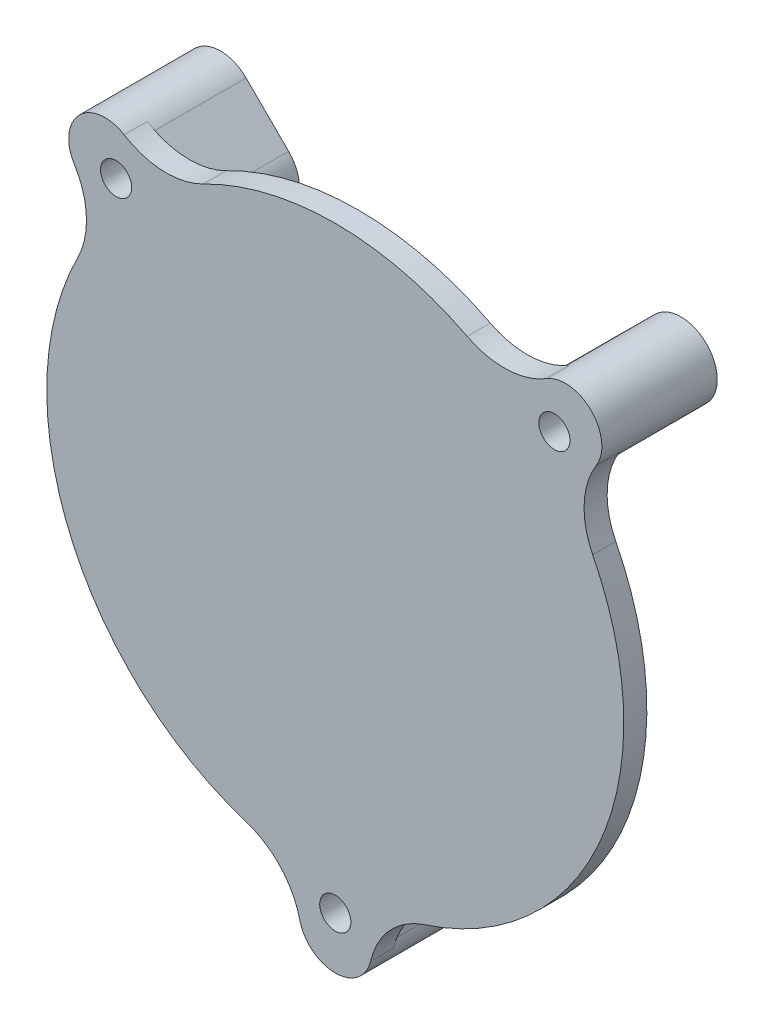
ISO-10303-21;
HEADER;
FILE_DESCRIPTION(('STEP AP214'),'2;1');
FILE_NAME('part.step','',(''),(''),'','','');
FILE_SCHEMA(('AUTOMOTIVE_DESIGN { 1 0 10303 214 1 1 1 1 }'));
ENDSEC;
DATA;
#1=APPLICATION_CONTEXT('core data for automotive mechanical design processes');
#2=APPLICATION_PROTOCOL_DEFINITION('international standard','automotive_design',2000,#1);
#3=PRODUCT_CONTEXT('',#1,'mechanical');
#4=PRODUCT('Part','Part','',(#3));
#5=PRODUCT_RELATED_PRODUCT_CATEGORY('part','',(#4));
#6=PRODUCT_DEFINITION_FORMATION('','',#4);
#7=PRODUCT_DEFINITION_CONTEXT('part definition',#1,'design');
#8=PRODUCT_DEFINITION('design','',#6,#7);
#9=PRODUCT_DEFINITION_SHAPE('','',#8);
#10=(LENGTH_UNIT() NAMED_UNIT(*) SI_UNIT(.MILLI.,.METRE.));
#11=(NAMED_UNIT(*) PLANE_ANGLE_UNIT() SI_UNIT($,.RADIAN.));
#12=(NAMED_UNIT(*) SI_UNIT($,.STERADIAN.) SOLID_ANGLE_UNIT());
#13=UNCERTAINTY_MEASURE_WITH_UNIT(LENGTH_MEASURE(1.E-05),#10,'distance_accuracy_value','');
#14=(GEOMETRIC_REPRESENTATION_CONTEXT(3) GLOBAL_UNCERTAINTY_ASSIGNED_CONTEXT((#13)) GLOBAL_UNIT_ASSIGNED_CONTEXT((#10,
#11,#12)) REPRESENTATION_CONTEXT('',''));
#15=CARTESIAN_POINT('',(0.,0.,0.));
#16=DIRECTION('',(0.,0.,1.));
#17=DIRECTION('',(1.,0.,0.));
#18=AXIS2_PLACEMENT_3D('',#15,#16,#17);
#19=CARTESIAN_POINT('',(0.,26.7665680473373,8.));
#20=DIRECTION('',(0.,0.,1.));
#21=DIRECTION('',(1.,0.,0.));
#22=AXIS2_PLACEMENT_3D('',#19,#20,#21);
#23=CYLINDRICAL_SURFACE('',#22,25.);
#24=CARTESIAN_POINT('',(0.,26.7665680473373,8.));
#25=DIRECTION('',(0.,0.,1.));
#26=DIRECTION('',(1.,0.,0.));
#27=AXIS2_PLACEMENT_3D('',#24,#25,#26);
#28=CIRCLE('',#27,25.);
#29=CARTESIAN_POINT('',(11.4326641616032,48.9992959539167,8.));
#30=VERTEX_POINT('',#29);
#31=CARTESIAN_POINT('',(-11.4326641616035,48.9992959539165,8.));
#32=VERTEX_POINT('',#31);
#33=EDGE_CURVE('E275',#30,#32,#28,.T.);
#34=ORIENTED_EDGE('',*,*,#33,.T.);
#35=DIRECTION('',(0.,0.,1.));
#36=VECTOR('',#35,1.);
#37=CARTESIAN_POINT('',(-11.4326641616035,48.9992959539165,8.));
#38=LINE('',#37,#36);
#39=CARTESIAN_POINT('',(-11.4326641616035,48.9992959539165,10.));
#40=VERTEX_POINT('',#39);
#41=EDGE_CURVE('E340',#32,#40,#38,.T.);
#42=ORIENTED_EDGE('',*,*,#41,.T.);
#43=CARTESIAN_POINT('',(0.,26.7665680473373,10.));
#44=DIRECTION('',(0.,0.,1.));
#45=DIRECTION('',(1.,0.,0.));
#46=AXIS2_PLACEMENT_3D('',#43,#44,#45);
#47=CIRCLE('',#46,25.);
#48=CARTESIAN_POINT('',(11.4326641616032,48.9992959539167,10.));
#49=VERTEX_POINT('',#48);
#50=EDGE_CURVE('E280',#49,#40,#47,.T.);
#51=ORIENTED_EDGE('',*,*,#50,.F.);
#52=DIRECTION('',(0.,0.,1.));
#53=VECTOR('',#52,1.);
#54=CARTESIAN_POINT('',(11.4326641616032,48.9992959539167,8.));
#55=LINE('',#54,#53);
#56=EDGE_CURVE('E337',#49,#30,#55,.F.);
#57=ORIENTED_EDGE('',*,*,#56,.T.);
#58=EDGE_LOOP('',(#34,#42,#51,#57));
#59=FACE_BOUND('',#58,.T.);
#60=ADVANCED_FACE('F34',(#59),#23,.T.);
#61=CARTESIAN_POINT('',(-22.3120005150945,38.0437411423298,10.));
#62=VERTEX_POINT('',#61);
#63=CARTESIAN_POINT('',(-7.71984683659709,2.98834345382563,10.));
#64=VERTEX_POINT('',#63);
#65=EDGE_CURVE('E270',#62,#64,#47,.T.);
#66=ORIENTED_EDGE('',*,*,#65,.F.);
#67=DIRECTION('',(0.,0.,1.));
#68=VECTOR('',#67,1.);
#69=CARTESIAN_POINT('',(-22.3120005150945,38.0437411423298,8.));
#70=LINE('',#69,#68);
#71=CARTESIAN_POINT('',(-22.3120005150945,38.0437411423298,8.));
#72=VERTEX_POINT('',#71);
#73=EDGE_CURVE('E323',#62,#72,#70,.F.);
#74=ORIENTED_EDGE('',*,*,#73,.T.);
#75=CARTESIAN_POINT('',(-7.71984683659709,2.98834345382563,8.));
#76=VERTEX_POINT('',#75);
#77=EDGE_CURVE('E276',#72,#76,#28,.T.);
#78=ORIENTED_EDGE('',*,*,#77,.T.);
#79=DIRECTION('',(0.,0.,1.));
#80=VECTOR('',#79,1.);
#81=CARTESIAN_POINT('',(-7.71984683659709,2.98834345382563,8.));
#82=LINE('',#81,#80);
#83=EDGE_CURVE('E321',#76,#64,#82,.T.);
#84=ORIENTED_EDGE('',*,*,#83,.T.);
#85=EDGE_LOOP('',(#66,#74,#78,#84));
#86=FACE_BOUND('',#85,.T.);
#87=ADVANCED_FACE('F400',(#86),#23,.T.);
#88=CARTESIAN_POINT('',(0.,26.7665680473373,8.));
#89=DIRECTION('',(0.,0.,1.));
#90=DIRECTION('',(1.,0.,0.));
#91=AXIS2_PLACEMENT_3D('',#88,#89,#90);
#92=PLANE('',#91);
#93=DIRECTION('',(0.709570736536527,-0.704634209963588,0.));
#94=VECTOR('',#93,1.);
#95=CARTESIAN_POINT('',(2.2195977613853,29.0017158674273,8.));
#96=LINE('',#95,#94);
#97=CARTESIAN_POINT('',(-17.7310961368432,48.8136115803503,8.));
#98=VERTEX_POINT('',#97);
#99=CARTESIAN_POINT('',(-14.0413283068533,45.1495136885397,8.));
#100=VERTEX_POINT('',#99);
#101=EDGE_CURVE('E201',#98,#100,#96,.T.);
#102=ORIENTED_EDGE('',*,*,#101,.F.);
#103=CARTESIAN_POINT('',(-19.9506938982285,46.5784637602603,8.));
#104=DIRECTION('',(0.,0.,1.));
#105=DIRECTION('',(1.,0.,0.));
#106=AXIS2_PLACEMENT_3D('',#103,#104,#105);
#107=CIRCLE('',#106,3.15);
#108=CARTESIAN_POINT('',(-18.3006265209049,49.2617039005184,8.));
#109=VERTEX_POINT('',#108);
#110=EDGE_CURVE('E326',#109,#98,#107,.F.);
#111=ORIENTED_EDGE('',*,*,#110,.F.);
#112=CARTESIAN_POINT('',(-14.6338101268525,55.2244597677587,8.));
#113=DIRECTION('',(0.,0.,1.));
#114=DIRECTION('',(1.,0.,0.));
#115=AXIS2_PLACEMENT_3D('',#112,#113,#114);
#116=CIRCLE('',#115,7.);
#117=EDGE_CURVE('E377',#109,#32,#116,.T.);
#118=ORIENTED_EDGE('',*,*,#117,.T.);
#119=ORIENTED_EDGE('',*,*,#33,.F.);
#120=CARTESIAN_POINT('',(14.6338101268521,55.2244597677589,8.));
#121=DIRECTION('',(0.,0.,1.));
#122=DIRECTION('',(1.,0.,0.));
#123=AXIS2_PLACEMENT_3D('',#120,#121,#122);
#124=CIRCLE('',#123,7.);
#125=CARTESIAN_POINT('',(18.3006265209046,49.2617039005186,8.));
#126=VERTEX_POINT('',#125);
#127=EDGE_CURVE('E379',#30,#126,#124,.T.);
#128=ORIENTED_EDGE('',*,*,#127,.T.);
#129=CARTESIAN_POINT('',(19.9506938982282,46.5784637602605,8.));
#130=DIRECTION('',(0.,0.,1.));
#131=DIRECTION('',(1.,0.,0.));
#132=AXIS2_PLACEMENT_3D('',#129,#130,#131);
#133=CIRCLE('',#132,3.15);
#134=CARTESIAN_POINT('',(17.7310961368429,48.8136115803506,8.));
#135=VERTEX_POINT('',#134);
#136=EDGE_CURVE('E351',#135,#126,#133,.F.);
#137=ORIENTED_EDGE('',*,*,#136,.F.);
#138=DIRECTION('',(0.709570736536517,0.704634209963598,0.));
#139=VECTOR('',#138,1.);
#140=CARTESIAN_POINT('',(-2.21959776138534,29.0017158674273,8.));
#141=LINE('',#140,#139);
#142=CARTESIAN_POINT('',(14.041328306853,45.1495136885399,8.));
#143=VERTEX_POINT('',#142);
#144=EDGE_CURVE('E57',#143,#135,#141,.T.);
#145=ORIENTED_EDGE('',*,*,#144,.F.);
#146=CARTESIAN_POINT('',(16.2609260682383,42.9143658684498,8.));
#147=DIRECTION('',(0.,0.,1.));
#148=DIRECTION('',(1.,0.,0.));
#149=AXIS2_PLACEMENT_3D('',#146,#147,#148);
#150=CIRCLE('',#149,3.15);
#151=CARTESIAN_POINT('',(18.4805238296237,40.6792180483598,8.));
#152=VERTEX_POINT('',#151);
#153=EDGE_CURVE('E315',#152,#143,#150,.F.);
#154=ORIENTED_EDGE('',*,*,#153,.F.);
#155=DIRECTION('',(-0.709570736536517,-0.704634209963599,0.));
#156=VECTOR('',#155,1.);
#157=CARTESIAN_POINT('',(2.21959776138533,24.5314202272473,8.));
#158=LINE('',#157,#156);
#159=CARTESIAN_POINT('',(22.1702916596135,44.3433159401705,8.));
#160=VERTEX_POINT('',#159);
#161=EDGE_CURVE('E318',#160,#152,#158,.T.);
#162=ORIENTED_EDGE('',*,*,#161,.F.);
#163=CARTESIAN_POINT('',(19.9506938982282,46.5784637602605,8.));
#164=DIRECTION('',(0.,0.,1.));
#165=DIRECTION('',(1.,0.,0.));
#166=AXIS2_PLACEMENT_3D('',#163,#164,#165);
#167=CIRCLE('',#166,3.15);
#168=CARTESIAN_POINT('',(22.6223490999466,44.9097041960539,8.));
#169=VERTEX_POINT('',#168);
#170=EDGE_CURVE('E343',#169,#160,#167,.F.);
#171=ORIENTED_EDGE('',*,*,#170,.F.);
#172=CARTESIAN_POINT('',(28.5593606593208,41.2013496089281,8.));
#173=DIRECTION('',(0.,0.,1.));
#174=DIRECTION('',(1.,0.,0.));
#175=AXIS2_PLACEMENT_3D('',#172,#173,#174);
#176=CIRCLE('',#175,7.);
#177=CARTESIAN_POINT('',(22.3120005150944,38.0437411423301,8.));
#178=VERTEX_POINT('',#177);
#179=EDGE_CURVE('E385',#169,#178,#176,.T.);
#180=ORIENTED_EDGE('',*,*,#179,.T.);
#181=CARTESIAN_POINT('',(7.71984683659709,2.98834345382564,8.));
#182=VERTEX_POINT('',#181);
#183=EDGE_CURVE('E271',#182,#178,#28,.T.);
#184=ORIENTED_EDGE('',*,*,#183,.F.);
#185=CARTESIAN_POINT('',(9.88140395084427,-3.66955943235762,8.));
#186=DIRECTION('',(0.,0.,1.));
#187=DIRECTION('',(1.,0.,0.));
#188=AXIS2_PLACEMENT_3D('',#185,#186,#187);
#189=CIRCLE('',#188,7.);
#190=CARTESIAN_POINT('',(3.06664260543443,-2.06986327211099,8.));
#191=VERTEX_POINT('',#190);
#192=EDGE_CURVE('E389',#182,#191,#189,.T.);
#193=ORIENTED_EDGE('',*,*,#192,.T.);
#194=CARTESIAN_POINT('',(0.,-1.35,8.));
#195=DIRECTION('',(0.,0.,1.));
#196=DIRECTION('',(1.,0.,0.));
#197=AXIS2_PLACEMENT_3D('',#194,#195,#196);
#198=CIRCLE('',#197,3.15);
#199=CARTESIAN_POINT('',(3.15,-1.35,8.));
#200=VERTEX_POINT('',#199);
#201=EDGE_CURVE('E365',#200,#191,#198,.F.);
#202=ORIENTED_EDGE('',*,*,#201,.F.);
#203=DIRECTION('',(0.,1.,0.));
#204=VECTOR('',#203,1.);
#205=CARTESIAN_POINT('',(3.15,3.85,8.));
#206=LINE('',#205,#204);
#207=CARTESIAN_POINT('',(3.15,3.85,8.));
#208=VERTEX_POINT('',#207);
#209=EDGE_CURVE('E49',#200,#208,#206,.T.);
#210=ORIENTED_EDGE('',*,*,#209,.T.);
#211=CARTESIAN_POINT('',(0.,3.85,8.));
#212=DIRECTION('',(0.,0.,1.));
#213=DIRECTION('',(1.,0.,0.));
#214=AXIS2_PLACEMENT_3D('',#211,#212,#213);
#215=CIRCLE('',#214,3.15);
#216=CARTESIAN_POINT('',(-3.15,3.85,8.));
#217=VERTEX_POINT('',#216);
#218=EDGE_CURVE('E274',#208,#217,#215,.T.);
#219=ORIENTED_EDGE('',*,*,#218,.T.);
#220=DIRECTION('',(0.,-1.,0.));
#221=VECTOR('',#220,1.);
#222=CARTESIAN_POINT('',(-3.15,3.85,8.));
#223=LINE('',#222,#221);
#224=CARTESIAN_POINT('',(-3.15,-1.35,8.));
#225=VERTEX_POINT('',#224);
#226=EDGE_CURVE('E282',#217,#225,#223,.T.);
#227=ORIENTED_EDGE('',*,*,#226,.T.);
#228=CARTESIAN_POINT('',(0.,-1.35,8.));
#229=DIRECTION('',(0.,0.,1.));
#230=DIRECTION('',(1.,0.,0.));
#231=AXIS2_PLACEMENT_3D('',#228,#229,#230);
#232=CIRCLE('',#231,3.15);
#233=CARTESIAN_POINT('',(-3.06664260543443,-2.06986327211099,8.));
#234=VERTEX_POINT('',#233);
#235=EDGE_CURVE('E359',#234,#225,#232,.F.);
#236=ORIENTED_EDGE('',*,*,#235,.F.);
#237=CARTESIAN_POINT('',(-9.88140395084427,-3.66955943235762,8.));
#238=DIRECTION('',(0.,0.,1.));
#239=DIRECTION('',(1.,0.,0.));
#240=AXIS2_PLACEMENT_3D('',#237,#238,#239);
#241=CIRCLE('',#240,7.);
#242=EDGE_CURVE('E42',#234,#76,#241,.T.);
#243=ORIENTED_EDGE('',*,*,#242,.T.);
#244=ORIENTED_EDGE('',*,*,#77,.F.);
#245=CARTESIAN_POINT('',(-28.559360659321,41.2013496089277,8.));
#246=DIRECTION('',(0.,0.,1.));
#247=DIRECTION('',(1.,0.,0.));
#248=AXIS2_PLACEMENT_3D('',#245,#246,#247);
#249=CIRCLE('',#248,7.);
#250=CARTESIAN_POINT('',(-22.6223490999469,44.9097041960536,8.));
#251=VERTEX_POINT('',#250);
#252=EDGE_CURVE('E371',#72,#251,#249,.T.);
#253=ORIENTED_EDGE('',*,*,#252,.T.);
#254=CARTESIAN_POINT('',(-19.9506938982285,46.5784637602603,8.));
#255=DIRECTION('',(0.,0.,1.));
#256=DIRECTION('',(1.,0.,0.));
#257=AXIS2_PLACEMENT_3D('',#254,#255,#256);
#258=CIRCLE('',#257,3.15);
#259=CARTESIAN_POINT('',(-22.1702916596138,44.3433159401702,8.));
#260=VERTEX_POINT('',#259);
#261=EDGE_CURVE('E334',#260,#251,#258,.F.);
#262=ORIENTED_EDGE('',*,*,#261,.F.);
#263=DIRECTION('',(-0.709570736536527,0.704634209963589,0.));
#264=VECTOR('',#263,1.);
#265=CARTESIAN_POINT('',(-2.2195977613853,24.5314202272472,8.));
#266=LINE('',#265,#264);
#267=CARTESIAN_POINT('',(-18.4805238296239,40.6792180483596,8.));
#268=VERTEX_POINT('',#267);
#269=EDGE_CURVE('E205',#268,#260,#266,.T.);
#270=ORIENTED_EDGE('',*,*,#269,.F.);
#271=CARTESIAN_POINT('',(-16.2609260682386,42.9143658684496,8.));
#272=DIRECTION('',(0.,0.,1.));
#273=DIRECTION('',(1.,0.,0.));
#274=AXIS2_PLACEMENT_3D('',#271,#272,#273);
#275=CIRCLE('',#274,3.15);
#276=EDGE_CURVE('E239',#100,#268,#275,.F.);
#277=ORIENTED_EDGE('',*,*,#276,.F.);
#278=EDGE_LOOP('',(#102,#111,#118,#119,#128,#137,#145,#154,#162,#171,#180,#184,#193,#202,#210,
#219,#227,#236,#243,#244,#253,#262,#270,#277));
#279=FACE_BOUND('',#278,.T.);
#280=ADVANCED_FACE('F394',(#279),#92,.F.);
#281=ORIENTED_EDGE('',*,*,#183,.T.);
#282=DIRECTION('',(0.,0.,1.));
#283=VECTOR('',#282,1.);
#284=CARTESIAN_POINT('',(22.3120005150944,38.0437411423301,8.));
#285=LINE('',#284,#283);
#286=CARTESIAN_POINT('',(22.3120005150944,38.0437411423301,10.));
#287=VERTEX_POINT('',#286);
#288=EDGE_CURVE('E356',#178,#287,#285,.T.);
#289=ORIENTED_EDGE('',*,*,#288,.T.);
#290=CARTESIAN_POINT('',(7.71984683659709,2.98834345382564,10.));
#291=VERTEX_POINT('',#290);
#292=EDGE_CURVE('E277',#291,#287,#47,.T.);
#293=ORIENTED_EDGE('',*,*,#292,.F.);
#294=DIRECTION('',(0.,0.,1.));
#295=VECTOR('',#294,1.);
#296=CARTESIAN_POINT('',(7.71984683659709,2.98834345382564,8.));
#297=LINE('',#296,#295);
#298=EDGE_CURVE('E354',#291,#182,#297,.F.);
#299=ORIENTED_EDGE('',*,*,#298,.T.);
#300=EDGE_LOOP('',(#281,#289,#293,#299));
#301=FACE_BOUND('',#300,.T.);
#302=ADVANCED_FACE('F418',(#301),#23,.T.);
#303=CARTESIAN_POINT('',(0.,3.85,10.));
#304=DIRECTION('',(0.,0.,-1.));
#305=DIRECTION('',(-1.,0.,0.));
#306=AXIS2_PLACEMENT_3D('',#303,#304,#305);
#307=CYLINDRICAL_SURFACE('',#306,3.15);
#308=ORIENTED_EDGE('',*,*,#218,.F.);
#309=DIRECTION('',(0.,0.,-1.));
#310=VECTOR('',#309,1.);
#311=CARTESIAN_POINT('',(3.15,3.85,10.));
#312=LINE('',#311,#310);
#313=CARTESIAN_POINT('',(3.15,3.85,0.));
#314=VERTEX_POINT('',#313);
#315=EDGE_CURVE('E294',#208,#314,#312,.T.);
#316=ORIENTED_EDGE('',*,*,#315,.T.);
#317=CARTESIAN_POINT('',(0.,3.85,0.));
#318=DIRECTION('',(0.,0.,1.));
#319=DIRECTION('',(1.,0.,0.));
#320=AXIS2_PLACEMENT_3D('',#317,#318,#319);
#321=CIRCLE('',#320,3.15);
#322=CARTESIAN_POINT('',(-3.15,3.85,0.));
#323=VERTEX_POINT('',#322);
#324=EDGE_CURVE('E288',#314,#323,#321,.T.);
#325=ORIENTED_EDGE('',*,*,#324,.T.);
#326=DIRECTION('',(0.,0.,-1.));
#327=VECTOR('',#326,1.);
#328=CARTESIAN_POINT('',(-3.15,3.85,10.));
#329=LINE('',#328,#327);
#330=EDGE_CURVE('E311',#217,#323,#329,.T.);
#331=ORIENTED_EDGE('',*,*,#330,.F.);
#332=EDGE_LOOP('',(#308,#316,#325,#331));
#333=FACE_BOUND('',#332,.T.);
#334=ADVANCED_FACE('F475',(#333),#307,.T.);
#335=CARTESIAN_POINT('',(0.,3.85,10.));
#336=DIRECTION('',(0.,0.,1.));
#337=DIRECTION('',(1.,0.,0.));
#338=AXIS2_PLACEMENT_3D('',#335,#336,#337);
#339=PLANE('',#338);
#340=CARTESIAN_POINT('',(19.9506938982282,46.5784637602605,10.));
#341=DIRECTION('',(0.,0.,1.));
#342=DIRECTION('',(-0.704634209963598,0.709570736536517,0.));
#343=AXIS2_PLACEMENT_3D('',#340,#341,#342);
#344=CIRCLE('',#343,3.15);
#345=CARTESIAN_POINT('',(22.6223490999466,44.9097041960539,10.));
#346=VERTEX_POINT('',#345);
#347=CARTESIAN_POINT('',(18.3006265209046,49.2617039005186,10.));
#348=VERTEX_POINT('',#347);
#349=EDGE_CURVE('E248',#346,#348,#344,.T.);
#350=ORIENTED_EDGE('',*,*,#349,.T.);
#351=CARTESIAN_POINT('',(14.6338101268521,55.2244597677589,10.));
#352=DIRECTION('',(0.,0.,1.));
#353=DIRECTION('',(1.,0.,0.));
#354=AXIS2_PLACEMENT_3D('',#351,#352,#353);
#355=CIRCLE('',#354,7.);
#356=EDGE_CURVE('E381',#348,#49,#355,.F.);
#357=ORIENTED_EDGE('',*,*,#356,.T.);
#358=ORIENTED_EDGE('',*,*,#50,.T.);
#359=CARTESIAN_POINT('',(-14.6338101268525,55.2244597677587,10.));
#360=DIRECTION('',(0.,0.,1.));
#361=DIRECTION('',(1.,0.,0.));
#362=AXIS2_PLACEMENT_3D('',#359,#360,#361);
#363=CIRCLE('',#362,7.);
#364=CARTESIAN_POINT('',(-18.3006265209049,49.2617039005184,10.));
#365=VERTEX_POINT('',#364);
#366=EDGE_CURVE('E375',#40,#365,#363,.F.);
#367=ORIENTED_EDGE('',*,*,#366,.T.);
#368=CARTESIAN_POINT('',(-19.9506938982285,46.5784637602603,10.));
#369=DIRECTION('',(0.,0.,1.));
#370=DIRECTION('',(-0.704634209963589,-0.709570736536527,0.));
#371=AXIS2_PLACEMENT_3D('',#368,#369,#370);
#372=CIRCLE('',#371,3.15);
#373=CARTESIAN_POINT('',(-22.6223490999469,44.9097041960536,10.));
#374=VERTEX_POINT('',#373);
#375=EDGE_CURVE('E227',#365,#374,#372,.T.);
#376=ORIENTED_EDGE('',*,*,#375,.T.);
#377=CARTESIAN_POINT('',(-28.559360659321,41.2013496089277,10.));
#378=DIRECTION('',(0.,0.,1.));
#379=DIRECTION('',(1.,0.,0.));
#380=AXIS2_PLACEMENT_3D('',#377,#378,#379);
#381=CIRCLE('',#380,7.);
#382=EDGE_CURVE('E373',#374,#62,#381,.F.);
#383=ORIENTED_EDGE('',*,*,#382,.T.);
#384=ORIENTED_EDGE('',*,*,#65,.T.);
#385=CARTESIAN_POINT('',(-9.88140395084427,-3.66955943235762,10.));
#386=DIRECTION('',(0.,0.,1.));
#387=DIRECTION('',(1.,0.,0.));
#388=AXIS2_PLACEMENT_3D('',#385,#386,#387);
#389=CIRCLE('',#388,7.);
#390=CARTESIAN_POINT('',(-3.06664260543443,-2.06986327211099,10.));
#391=VERTEX_POINT('',#390);
#392=EDGE_CURVE('E11',#64,#391,#389,.F.);
#393=ORIENTED_EDGE('',*,*,#392,.T.);
#394=CARTESIAN_POINT('',(0.,-1.35,10.));
#395=DIRECTION('',(0.,0.,1.));
#396=DIRECTION('',(1.,0.,0.));
#397=AXIS2_PLACEMENT_3D('',#394,#395,#396);
#398=CIRCLE('',#397,3.15);
#399=CARTESIAN_POINT('',(3.06664260543443,-2.06986327211099,10.));
#400=VERTEX_POINT('',#399);
#401=EDGE_CURVE('E291',#391,#400,#398,.T.);
#402=ORIENTED_EDGE('',*,*,#401,.T.);
#403=CARTESIAN_POINT('',(9.88140395084427,-3.66955943235762,10.));
#404=DIRECTION('',(0.,0.,1.));
#405=DIRECTION('',(1.,0.,0.));
#406=AXIS2_PLACEMENT_3D('',#403,#404,#405);
#407=CIRCLE('',#406,7.);
#408=EDGE_CURVE('E387',#400,#291,#407,.F.);
#409=ORIENTED_EDGE('',*,*,#408,.T.);
#410=ORIENTED_EDGE('',*,*,#292,.T.);
#411=CARTESIAN_POINT('',(28.5593606593208,41.2013496089281,10.));
#412=DIRECTION('',(0.,0.,1.));
#413=DIRECTION('',(1.,0.,0.));
#414=AXIS2_PLACEMENT_3D('',#411,#412,#413);
#415=CIRCLE('',#414,7.);
#416=EDGE_CURVE('E383',#287,#346,#415,.F.);
#417=ORIENTED_EDGE('',*,*,#416,.T.);
#418=EDGE_LOOP('',(#350,#357,#358,#367,#376,#383,#384,#393,#402,#409,#410,#417));
#419=FACE_BOUND('',#418,.T.);
#420=CARTESIAN_POINT('',(18.9927734039039,45.6272075768097,10.));
#421=DIRECTION('',(0.,0.,1.));
#422=DIRECTION('',(-0.704634209963598,0.709570736536517,0.));
#423=AXIS2_PLACEMENT_3D('',#420,#421,#422);
#424=CIRCLE('',#423,1.35);
#425=CARTESIAN_POINT('',(18.0415172204531,46.585128071134,10.));
#426=VERTEX_POINT('',#425);
#427=EDGE_CURVE('E242',#426,#426,#424,.T.);
#428=ORIENTED_EDGE('',*,*,#427,.F.);
#429=EDGE_LOOP('',(#428));
#430=FACE_BOUND('',#429,.T.);
#431=CARTESIAN_POINT('',(0.,0.,10.));
#432=DIRECTION('',(0.,0.,1.));
#433=DIRECTION('',(1.,0.,0.));
#434=AXIS2_PLACEMENT_3D('',#431,#432,#433);
#435=CIRCLE('',#434,1.35);
#436=CARTESIAN_POINT('',(1.35,0.,10.));
#437=VERTEX_POINT('',#436);
#438=EDGE_CURVE('E285',#437,#437,#435,.T.);
#439=ORIENTED_EDGE('',*,*,#438,.F.);
#440=EDGE_LOOP('',(#439));
#441=FACE_BOUND('',#440,.T.);
#442=CARTESIAN_POINT('',(-18.9927734039042,45.6272075768094,10.));
#443=DIRECTION('',(0.,0.,1.));
#444=DIRECTION('',(-0.704634209963589,-0.709570736536527,0.));
#445=AXIS2_PLACEMENT_3D('',#442,#443,#444);
#446=CIRCLE('',#445,1.35);
#447=CARTESIAN_POINT('',(-19.944029587355,44.6692870824851,10.));
#448=VERTEX_POINT('',#447);
#449=EDGE_CURVE('E221',#448,#448,#446,.T.);
#450=ORIENTED_EDGE('',*,*,#449,.F.);
#451=EDGE_LOOP('',(#450));
#452=FACE_BOUND('',#451,.T.);
#453=ADVANCED_FACE('F406',(#419,#430,#441,#452),#339,.T.);
#454=CARTESIAN_POINT('',(0.,3.85,0.));
#455=DIRECTION('',(0.,0.,1.));
#456=DIRECTION('',(1.,0.,0.));
#457=AXIS2_PLACEMENT_3D('',#454,#455,#456);
#458=PLANE('',#457);
#459=ORIENTED_EDGE('',*,*,#324,.F.);
#460=DIRECTION('',(0.,1.,0.));
#461=VECTOR('',#460,1.);
#462=CARTESIAN_POINT('',(3.15,3.85,0.));
#463=LINE('',#462,#461);
#464=CARTESIAN_POINT('',(3.15,-1.35,0.));
#465=VERTEX_POINT('',#464);
#466=EDGE_CURVE('E295',#465,#314,#463,.T.);
#467=ORIENTED_EDGE('',*,*,#466,.F.);
#468=CARTESIAN_POINT('',(0.,-1.35,0.));
#469=DIRECTION('',(0.,0.,1.));
#470=DIRECTION('',(1.,0.,0.));
#471=AXIS2_PLACEMENT_3D('',#468,#469,#470);
#472=CIRCLE('',#471,3.15);
#473=CARTESIAN_POINT('',(-3.15,-1.35,0.));
#474=VERTEX_POINT('',#473);
#475=EDGE_CURVE('E301',#474,#465,#472,.T.);
#476=ORIENTED_EDGE('',*,*,#475,.F.);
#477=DIRECTION('',(0.,-1.,0.));
#478=VECTOR('',#477,1.);
#479=CARTESIAN_POINT('',(-3.15,3.85,0.));
#480=LINE('',#479,#478);
#481=EDGE_CURVE('E298',#323,#474,#480,.T.);
#482=ORIENTED_EDGE('',*,*,#481,.F.);
#483=EDGE_LOOP('',(#459,#467,#476,#482));
#484=FACE_BOUND('',#483,.T.);
#485=CARTESIAN_POINT('',(0.,0.,0.));
#486=DIRECTION('',(0.,0.,1.));
#487=DIRECTION('',(1.,0.,0.));
#488=AXIS2_PLACEMENT_3D('',#485,#486,#487);
#489=CIRCLE('',#488,1.35);
#490=CARTESIAN_POINT('',(1.35,0.,0.));
#491=VERTEX_POINT('',#490);
#492=EDGE_CURVE('E284',#491,#491,#489,.T.);
#493=ORIENTED_EDGE('',*,*,#492,.T.);
#494=EDGE_LOOP('',(#493));
#495=FACE_BOUND('',#494,.T.);
#496=ADVANCED_FACE('F572',(#484,#495),#458,.F.);
#497=CARTESIAN_POINT('',(-3.15,3.85,10.));
#498=DIRECTION('',(1.,0.,0.));
#499=DIRECTION('',(0.,1.,0.));
#500=AXIS2_PLACEMENT_3D('',#497,#498,#499);
#501=PLANE('',#500);
#502=DIRECTION('',(0.,0.,-1.));
#503=VECTOR('',#502,1.);
#504=CARTESIAN_POINT('',(-3.15,-1.35,10.));
#505=LINE('',#504,#503);
#506=EDGE_CURVE('E309',#225,#474,#505,.T.);
#507=ORIENTED_EDGE('',*,*,#506,.F.);
#508=ORIENTED_EDGE('',*,*,#226,.F.);
#509=ORIENTED_EDGE('',*,*,#330,.T.);
#510=ORIENTED_EDGE('',*,*,#481,.T.);
#511=EDGE_LOOP('',(#507,#508,#509,#510));
#512=FACE_BOUND('',#511,.T.);
#513=ADVANCED_FACE('F565',(#512),#501,.F.);
#514=CARTESIAN_POINT('',(0.,-1.35,10.));
#515=DIRECTION('',(0.,0.,-1.));
#516=DIRECTION('',(-1.,0.,0.));
#517=AXIS2_PLACEMENT_3D('',#514,#515,#516);
#518=CYLINDRICAL_SURFACE('',#517,3.15);
#519=ORIENTED_EDGE('',*,*,#201,.T.);
#520=DIRECTION('',(0.,0.,-1.));
#521=VECTOR('',#520,1.);
#522=CARTESIAN_POINT('',(3.06664260543443,-2.06986327211099,10.));
#523=LINE('',#522,#521);
#524=EDGE_CURVE('E368',#191,#400,#523,.F.);
#525=ORIENTED_EDGE('',*,*,#524,.T.);
#526=ORIENTED_EDGE('',*,*,#401,.F.);
#527=DIRECTION('',(0.,0.,-1.));
#528=VECTOR('',#527,1.);
#529=CARTESIAN_POINT('',(-3.06664260543443,-2.06986327211099,10.));
#530=LINE('',#529,#528);
#531=EDGE_CURVE('E362',#391,#234,#530,.T.);
#532=ORIENTED_EDGE('',*,*,#531,.T.);
#533=ORIENTED_EDGE('',*,*,#235,.T.);
#534=ORIENTED_EDGE('',*,*,#506,.T.);
#535=ORIENTED_EDGE('',*,*,#475,.T.);
#536=DIRECTION('',(0.,0.,-1.));
#537=VECTOR('',#536,1.);
#538=CARTESIAN_POINT('',(3.15,-1.35,10.));
#539=LINE('',#538,#537);
#540=EDGE_CURVE('E307',#200,#465,#539,.T.);
#541=ORIENTED_EDGE('',*,*,#540,.F.);
#542=EDGE_LOOP('',(#519,#525,#526,#532,#533,#534,#535,#541));
#543=FACE_BOUND('',#542,.T.);
#544=ADVANCED_FACE('F409',(#543),#518,.T.);
#545=CARTESIAN_POINT('',(3.15,3.85,10.));
#546=DIRECTION('',(-1.,0.,0.));
#547=DIRECTION('',(0.,0.,1.));
#548=AXIS2_PLACEMENT_3D('',#545,#546,#547);
#549=PLANE('',#548);
#550=ORIENTED_EDGE('',*,*,#209,.F.);
#551=ORIENTED_EDGE('',*,*,#540,.T.);
#552=ORIENTED_EDGE('',*,*,#466,.T.);
#553=ORIENTED_EDGE('',*,*,#315,.F.);
#554=EDGE_LOOP('',(#550,#551,#552,#553));
#555=FACE_BOUND('',#554,.T.);
#556=ADVANCED_FACE('F552',(#555),#549,.F.);
#557=CARTESIAN_POINT('',(0.,0.,10.));
#558=DIRECTION('',(0.,0.,-1.));
#559=DIRECTION('',(-1.,0.,0.));
#560=AXIS2_PLACEMENT_3D('',#557,#558,#559);
#561=CYLINDRICAL_SURFACE('',#560,1.35);
#562=ORIENTED_EDGE('',*,*,#438,.T.);
#563=EDGE_LOOP('',(#562));
#564=FACE_BOUND('',#563,.T.);
#565=ORIENTED_EDGE('',*,*,#492,.F.);
#566=EDGE_LOOP('',(#565));
#567=FACE_BOUND('',#566,.T.);
#568=ADVANCED_FACE('F489',(#564,#567),#561,.F.);
#569=CARTESIAN_POINT('',(16.2609260682383,42.9143658684498,10.));
#570=DIRECTION('',(0.,0.,-1.));
#571=DIRECTION('',(-1.,0.,0.));
#572=AXIS2_PLACEMENT_3D('',#569,#570,#571);
#573=CYLINDRICAL_SURFACE('',#572,3.15);
#574=DIRECTION('',(0.,0.,-1.));
#575=VECTOR('',#574,1.);
#576=CARTESIAN_POINT('',(18.4805238296237,40.6792180483598,10.));
#577=LINE('',#576,#575);
#578=CARTESIAN_POINT('',(18.4805238296237,40.6792180483598,0.));
#579=VERTEX_POINT('',#578);
#580=EDGE_CURVE('E268',#152,#579,#577,.T.);
#581=ORIENTED_EDGE('',*,*,#580,.F.);
#582=ORIENTED_EDGE('',*,*,#153,.T.);
#583=DIRECTION('',(0.,0.,-1.));
#584=VECTOR('',#583,1.);
#585=CARTESIAN_POINT('',(14.041328306853,45.1495136885399,10.));
#586=LINE('',#585,#584);
#587=CARTESIAN_POINT('',(14.041328306853,45.1495136885399,0.));
#588=VERTEX_POINT('',#587);
#589=EDGE_CURVE('E251',#143,#588,#586,.T.);
#590=ORIENTED_EDGE('',*,*,#589,.T.);
#591=CARTESIAN_POINT('',(16.2609260682383,42.9143658684498,0.));
#592=DIRECTION('',(0.,0.,1.));
#593=DIRECTION('',(-0.704634209963598,0.709570736536517,0.));
#594=AXIS2_PLACEMENT_3D('',#591,#592,#593);
#595=CIRCLE('',#594,3.15);
#596=EDGE_CURVE('E245',#588,#579,#595,.T.);
#597=ORIENTED_EDGE('',*,*,#596,.T.);
#598=EDGE_LOOP('',(#581,#582,#590,#597));
#599=FACE_BOUND('',#598,.T.);
#600=ADVANCED_FACE('F485',(#599),#573,.T.);
#601=CARTESIAN_POINT('',(16.2609260682383,42.9143658684498,0.));
#602=DIRECTION('',(0.,0.,1.));
#603=DIRECTION('',(-0.704634209963598,0.709570736536517,0.));
#604=AXIS2_PLACEMENT_3D('',#601,#602,#603);
#605=PLANE('',#604);
#606=ORIENTED_EDGE('',*,*,#596,.F.);
#607=DIRECTION('',(-0.709570736536517,-0.704634209963598,0.));
#608=VECTOR('',#607,1.);
#609=CARTESIAN_POINT('',(14.041328306853,45.1495136885399,0.));
#610=LINE('',#609,#608);
#611=CARTESIAN_POINT('',(17.7310961368429,48.8136115803506,0.));
#612=VERTEX_POINT('',#611);
#613=EDGE_CURVE('E252',#612,#588,#610,.T.);
#614=ORIENTED_EDGE('',*,*,#613,.F.);
#615=CARTESIAN_POINT('',(19.9506938982282,46.5784637602605,0.));
#616=DIRECTION('',(0.,0.,1.));
#617=DIRECTION('',(-0.704634209963598,0.709570736536517,0.));
#618=AXIS2_PLACEMENT_3D('',#615,#616,#617);
#619=CIRCLE('',#618,3.15);
#620=CARTESIAN_POINT('',(22.1702916596135,44.3433159401705,0.));
#621=VERTEX_POINT('',#620);
#622=EDGE_CURVE('E258',#621,#612,#619,.T.);
#623=ORIENTED_EDGE('',*,*,#622,.F.);
#624=DIRECTION('',(0.709570736536517,0.704634209963599,0.));
#625=VECTOR('',#624,1.);
#626=CARTESIAN_POINT('',(18.4805238296237,40.6792180483598,0.));
#627=LINE('',#626,#625);
#628=EDGE_CURVE('E255',#579,#621,#627,.T.);
#629=ORIENTED_EDGE('',*,*,#628,.F.);
#630=EDGE_LOOP('',(#606,#614,#623,#629));
#631=FACE_BOUND('',#630,.T.);
#632=CARTESIAN_POINT('',(18.9927734039039,45.6272075768097,0.));
#633=DIRECTION('',(0.,0.,1.));
#634=DIRECTION('',(-0.704634209963598,0.709570736536517,0.));
#635=AXIS2_PLACEMENT_3D('',#632,#633,#634);
#636=CIRCLE('',#635,1.35);
#637=CARTESIAN_POINT('',(18.0415172204531,46.585128071134,0.));
#638=VERTEX_POINT('',#637);
#639=EDGE_CURVE('E241',#638,#638,#636,.T.);
#640=ORIENTED_EDGE('',*,*,#639,.T.);
#641=EDGE_LOOP('',(#640));
#642=FACE_BOUND('',#641,.T.);
#643=ADVANCED_FACE('F488',(#631,#642),#605,.F.);
#644=CARTESIAN_POINT('',(18.4805238296237,40.6792180483598,10.));
#645=DIRECTION('',(-0.704634209963599,0.709570736536517,0.));
#646=DIRECTION('',(-0.709570736536517,-0.704634209963599,0.));
#647=AXIS2_PLACEMENT_3D('',#644,#645,#646);
#648=PLANE('',#647);
#649=DIRECTION('',(0.,0.,-1.));
#650=VECTOR('',#649,1.);
#651=CARTESIAN_POINT('',(22.1702916596135,44.3433159401705,10.));
#652=LINE('',#651,#650);
#653=EDGE_CURVE('E266',#160,#621,#652,.T.);
#654=ORIENTED_EDGE('',*,*,#653,.F.);
#655=ORIENTED_EDGE('',*,*,#161,.T.);
#656=ORIENTED_EDGE('',*,*,#580,.T.);
#657=ORIENTED_EDGE('',*,*,#628,.T.);
#658=EDGE_LOOP('',(#654,#655,#656,#657));
#659=FACE_BOUND('',#658,.T.);
#660=ADVANCED_FACE('F491',(#659),#648,.F.);
#661=CARTESIAN_POINT('',(19.9506938982282,46.5784637602605,10.));
#662=DIRECTION('',(0.,0.,-1.));
#663=DIRECTION('',(-1.,0.,0.));
#664=AXIS2_PLACEMENT_3D('',#661,#662,#663);
#665=CYLINDRICAL_SURFACE('',#664,3.15);
#666=DIRECTION('',(0.,0.,-1.));
#667=VECTOR('',#666,1.);
#668=CARTESIAN_POINT('',(17.7310961368429,48.8136115803506,10.));
#669=LINE('',#668,#667);
#670=EDGE_CURVE('E264',#135,#612,#669,.T.);
#671=ORIENTED_EDGE('',*,*,#670,.F.);
#672=ORIENTED_EDGE('',*,*,#136,.T.);
#673=DIRECTION('',(0.,0.,-1.));
#674=VECTOR('',#673,1.);
#675=CARTESIAN_POINT('',(18.3006265209046,49.2617039005186,10.));
#676=LINE('',#675,#674);
#677=EDGE_CURVE('E349',#126,#348,#676,.F.);
#678=ORIENTED_EDGE('',*,*,#677,.T.);
#679=ORIENTED_EDGE('',*,*,#349,.F.);
#680=DIRECTION('',(0.,0.,-1.));
#681=VECTOR('',#680,1.);
#682=CARTESIAN_POINT('',(22.6223490999466,44.9097041960539,10.));
#683=LINE('',#682,#681);
#684=EDGE_CURVE('E346',#346,#169,#683,.T.);
#685=ORIENTED_EDGE('',*,*,#684,.T.);
#686=ORIENTED_EDGE('',*,*,#170,.T.);
#687=ORIENTED_EDGE('',*,*,#653,.T.);
#688=ORIENTED_EDGE('',*,*,#622,.T.);
#689=EDGE_LOOP('',(#671,#672,#678,#679,#685,#686,#687,#688));
#690=FACE_BOUND('',#689,.T.);
#691=ADVANCED_FACE('F429',(#690),#665,.T.);
#692=CARTESIAN_POINT('',(14.041328306853,45.1495136885399,10.));
#693=DIRECTION('',(0.704634209963598,-0.709570736536517,0.));
#694=DIRECTION('',(0.709570736536517,0.704634209963598,0.));
#695=AXIS2_PLACEMENT_3D('',#692,#693,#694);
#696=PLANE('',#695);
#697=ORIENTED_EDGE('',*,*,#144,.T.);
#698=ORIENTED_EDGE('',*,*,#670,.T.);
#699=ORIENTED_EDGE('',*,*,#613,.T.);
#700=ORIENTED_EDGE('',*,*,#589,.F.);
#701=EDGE_LOOP('',(#697,#698,#699,#700));
#702=FACE_BOUND('',#701,.T.);
#703=ADVANCED_FACE('F497',(#702),#696,.F.);
#704=CARTESIAN_POINT('',(18.9927734039039,45.6272075768097,10.));
#705=DIRECTION('',(0.,0.,-1.));
#706=DIRECTION('',(-1.,0.,0.));
#707=AXIS2_PLACEMENT_3D('',#704,#705,#706);
#708=CYLINDRICAL_SURFACE('',#707,1.35);
#709=ORIENTED_EDGE('',*,*,#427,.T.);
#710=EDGE_LOOP('',(#709));
#711=FACE_BOUND('',#710,.T.);
#712=ORIENTED_EDGE('',*,*,#639,.F.);
#713=EDGE_LOOP('',(#712));
#714=FACE_BOUND('',#713,.T.);
#715=ADVANCED_FACE('F500',(#711,#714),#708,.F.);
#716=CARTESIAN_POINT('',(-16.2609260682386,42.9143658684496,10.));
#717=DIRECTION('',(0.,0.,-1.));
#718=DIRECTION('',(-1.,0.,0.));
#719=AXIS2_PLACEMENT_3D('',#716,#717,#718);
#720=CYLINDRICAL_SURFACE('',#719,3.15);
#721=DIRECTION('',(0.,0.,-1.));
#722=VECTOR('',#721,1.);
#723=CARTESIAN_POINT('',(-14.0413283068533,45.1495136885397,10.));
#724=LINE('',#723,#722);
#725=CARTESIAN_POINT('',(-14.0413283068533,45.1495136885397,0.));
#726=VERTEX_POINT('',#725);
#727=EDGE_CURVE('E195',#100,#726,#724,.T.);
#728=ORIENTED_EDGE('',*,*,#727,.F.);
#729=ORIENTED_EDGE('',*,*,#276,.T.);
#730=DIRECTION('',(0.,0.,-1.));
#731=VECTOR('',#730,1.);
#732=CARTESIAN_POINT('',(-18.4805238296239,40.6792180483596,10.));
#733=LINE('',#732,#731);
#734=CARTESIAN_POINT('',(-18.4805238296239,40.6792180483596,0.));
#735=VERTEX_POINT('',#734);
#736=EDGE_CURVE('E219',#268,#735,#733,.T.);
#737=ORIENTED_EDGE('',*,*,#736,.T.);
#738=CARTESIAN_POINT('',(-16.2609260682386,42.9143658684496,0.));
#739=DIRECTION('',(0.,0.,1.));
#740=DIRECTION('',(-0.704634209963589,-0.709570736536527,0.));
#741=AXIS2_PLACEMENT_3D('',#738,#739,#740);
#742=CIRCLE('',#741,3.15);
#743=EDGE_CURVE('E213',#735,#726,#742,.T.);
#744=ORIENTED_EDGE('',*,*,#743,.T.);
#745=EDGE_LOOP('',(#728,#729,#737,#744));
#746=FACE_BOUND('',#745,.T.);
#747=ADVANCED_FACE('F217',(#746),#720,.T.);
#748=CARTESIAN_POINT('',(-16.2609260682386,42.9143658684496,0.));
#749=DIRECTION('',(0.,0.,1.));
#750=DIRECTION('',(-0.704634209963589,-0.709570736536527,0.));
#751=AXIS2_PLACEMENT_3D('',#748,#749,#750);
#752=PLANE('',#751);
#753=ORIENTED_EDGE('',*,*,#743,.F.);
#754=DIRECTION('',(0.709570736536527,-0.704634209963589,0.));
#755=VECTOR('',#754,1.);
#756=CARTESIAN_POINT('',(-18.4805238296239,40.6792180483596,0.));
#757=LINE('',#756,#755);
#758=CARTESIAN_POINT('',(-22.1702916596138,44.3433159401702,0.));
#759=VERTEX_POINT('',#758);
#760=EDGE_CURVE('E231',#759,#735,#757,.T.);
#761=ORIENTED_EDGE('',*,*,#760,.F.);
#762=CARTESIAN_POINT('',(-19.9506938982285,46.5784637602603,0.));
#763=DIRECTION('',(0.,0.,1.));
#764=DIRECTION('',(-0.704634209963589,-0.709570736536527,0.));
#765=AXIS2_PLACEMENT_3D('',#762,#763,#764);
#766=CIRCLE('',#765,3.15);
#767=CARTESIAN_POINT('',(-17.7310961368432,48.8136115803503,0.));
#768=VERTEX_POINT('',#767);
#769=EDGE_CURVE('E215',#768,#759,#766,.T.);
#770=ORIENTED_EDGE('',*,*,#769,.F.);
#771=DIRECTION('',(-0.709570736536527,0.704634209963588,0.));
#772=VECTOR('',#771,1.);
#773=CARTESIAN_POINT('',(-14.0413283068533,45.1495136885397,0.));
#774=LINE('',#773,#772);
#775=EDGE_CURVE('E199',#726,#768,#774,.T.);
#776=ORIENTED_EDGE('',*,*,#775,.F.);
#777=EDGE_LOOP('',(#753,#761,#770,#776));
#778=FACE_BOUND('',#777,.T.);
#779=CARTESIAN_POINT('',(-18.9927734039042,45.6272075768094,0.));
#780=DIRECTION('',(0.,0.,1.));
#781=DIRECTION('',(-0.704634209963589,-0.709570736536527,0.));
#782=AXIS2_PLACEMENT_3D('',#779,#780,#781);
#783=CIRCLE('',#782,1.35);
#784=CARTESIAN_POINT('',(-19.944029587355,44.6692870824851,0.));
#785=VERTEX_POINT('',#784);
#786=EDGE_CURVE('E224',#785,#785,#783,.T.);
#787=ORIENTED_EDGE('',*,*,#786,.T.);
#788=EDGE_LOOP('',(#787));
#789=FACE_BOUND('',#788,.T.);
#790=ADVANCED_FACE('F210',(#778,#789),#752,.F.);
#791=CARTESIAN_POINT('',(-14.0413283068533,45.1495136885397,10.));
#792=DIRECTION('',(-0.704634209963588,-0.709570736536527,0.));
#793=DIRECTION('',(0.709570736536527,-0.704634209963588,0.));
#794=AXIS2_PLACEMENT_3D('',#791,#792,#793);
#795=PLANE('',#794);
#796=DIRECTION('',(0.,0.,-1.));
#797=VECTOR('',#796,1.);
#798=CARTESIAN_POINT('',(-17.7310961368432,48.8136115803503,10.));
#799=LINE('',#798,#797);
#800=EDGE_CURVE('E206',#98,#768,#799,.T.);
#801=ORIENTED_EDGE('',*,*,#800,.F.);
#802=ORIENTED_EDGE('',*,*,#101,.T.);
#803=ORIENTED_EDGE('',*,*,#727,.T.);
#804=ORIENTED_EDGE('',*,*,#775,.T.);
#805=EDGE_LOOP('',(#801,#802,#803,#804));
#806=FACE_BOUND('',#805,.T.);
#807=ADVANCED_FACE('F198',(#806),#795,.F.);
#808=CARTESIAN_POINT('',(-19.9506938982285,46.5784637602603,10.));
#809=DIRECTION('',(0.,0.,-1.));
#810=DIRECTION('',(-1.,0.,0.));
#811=AXIS2_PLACEMENT_3D('',#808,#809,#810);
#812=CYLINDRICAL_SURFACE('',#811,3.15);
#813=DIRECTION('',(0.,0.,-1.));
#814=VECTOR('',#813,1.);
#815=CARTESIAN_POINT('',(-22.1702916596138,44.3433159401702,10.));
#816=LINE('',#815,#814);
#817=EDGE_CURVE('E234',#260,#759,#816,.T.);
#818=ORIENTED_EDGE('',*,*,#817,.F.);
#819=ORIENTED_EDGE('',*,*,#261,.T.);
#820=DIRECTION('',(0.,0.,-1.));
#821=VECTOR('',#820,1.);
#822=CARTESIAN_POINT('',(-22.6223490999469,44.9097041960536,10.));
#823=LINE('',#822,#821);
#824=EDGE_CURVE('E332',#251,#374,#823,.F.);
#825=ORIENTED_EDGE('',*,*,#824,.T.);
#826=ORIENTED_EDGE('',*,*,#375,.F.);
#827=DIRECTION('',(0.,0.,-1.));
#828=VECTOR('',#827,1.);
#829=CARTESIAN_POINT('',(-18.3006265209049,49.2617039005184,10.));
#830=LINE('',#829,#828);
#831=EDGE_CURVE('E329',#365,#109,#830,.T.);
#832=ORIENTED_EDGE('',*,*,#831,.T.);
#833=ORIENTED_EDGE('',*,*,#110,.T.);
#834=ORIENTED_EDGE('',*,*,#800,.T.);
#835=ORIENTED_EDGE('',*,*,#769,.T.);
#836=EDGE_LOOP('',(#818,#819,#825,#826,#832,#833,#834,#835));
#837=FACE_BOUND('',#836,.T.);
#838=ADVANCED_FACE('F449',(#837),#812,.T.);
#839=CARTESIAN_POINT('',(-18.4805238296239,40.6792180483596,10.));
#840=DIRECTION('',(0.704634209963589,0.709570736536527,0.));
#841=DIRECTION('',(-0.709570736536527,0.704634209963589,0.));
#842=AXIS2_PLACEMENT_3D('',#839,#840,#841);
#843=PLANE('',#842);
#844=ORIENTED_EDGE('',*,*,#269,.T.);
#845=ORIENTED_EDGE('',*,*,#817,.T.);
#846=ORIENTED_EDGE('',*,*,#760,.T.);
#847=ORIENTED_EDGE('',*,*,#736,.F.);
#848=EDGE_LOOP('',(#844,#845,#846,#847));
#849=FACE_BOUND('',#848,.T.);
#850=ADVANCED_FACE('F455',(#849),#843,.F.);
#851=CARTESIAN_POINT('',(-18.9927734039042,45.6272075768094,10.));
#852=DIRECTION('',(0.,0.,-1.));
#853=DIRECTION('',(-1.,0.,0.));
#854=AXIS2_PLACEMENT_3D('',#851,#852,#853);
#855=CYLINDRICAL_SURFACE('',#854,1.35);
#856=ORIENTED_EDGE('',*,*,#449,.T.);
#857=EDGE_LOOP('',(#856));
#858=FACE_BOUND('',#857,.T.);
#859=ORIENTED_EDGE('',*,*,#786,.F.);
#860=EDGE_LOOP('',(#859));
#861=FACE_BOUND('',#860,.T.);
#862=ADVANCED_FACE('F457',(#858,#861),#855,.F.);
#863=CARTESIAN_POINT('',(-28.559360659321,41.2013496089277,10.));
#864=DIRECTION('',(0.,0.,1.));
#865=DIRECTION('',(1.,0.,0.));
#866=AXIS2_PLACEMENT_3D('',#863,#864,#865);
#867=CYLINDRICAL_SURFACE('',#866,7.);
#868=ORIENTED_EDGE('',*,*,#382,.F.);
#869=ORIENTED_EDGE('',*,*,#824,.F.);
#870=ORIENTED_EDGE('',*,*,#252,.F.);
#871=ORIENTED_EDGE('',*,*,#73,.F.);
#872=EDGE_LOOP('',(#868,#869,#870,#871));
#873=FACE_BOUND('',#872,.T.);
#874=ADVANCED_FACE('F453',(#873),#867,.F.);
#875=CARTESIAN_POINT('',(-14.6338101268525,55.2244597677587,10.));
#876=DIRECTION('',(0.,0.,-1.));
#877=DIRECTION('',(-1.,0.,0.));
#878=AXIS2_PLACEMENT_3D('',#875,#876,#877);
#879=CYLINDRICAL_SURFACE('',#878,7.);
#880=ORIENTED_EDGE('',*,*,#117,.F.);
#881=ORIENTED_EDGE('',*,*,#831,.F.);
#882=ORIENTED_EDGE('',*,*,#366,.F.);
#883=ORIENTED_EDGE('',*,*,#41,.F.);
#884=EDGE_LOOP('',(#880,#881,#882,#883));
#885=FACE_BOUND('',#884,.T.);
#886=ADVANCED_FACE('F442',(#885),#879,.F.);
#887=CARTESIAN_POINT('',(14.6338101268521,55.2244597677589,10.));
#888=DIRECTION('',(0.,0.,1.));
#889=DIRECTION('',(1.,0.,0.));
#890=AXIS2_PLACEMENT_3D('',#887,#888,#889);
#891=CYLINDRICAL_SURFACE('',#890,7.);
#892=ORIENTED_EDGE('',*,*,#356,.F.);
#893=ORIENTED_EDGE('',*,*,#677,.F.);
#894=ORIENTED_EDGE('',*,*,#127,.F.);
#895=ORIENTED_EDGE('',*,*,#56,.F.);
#896=EDGE_LOOP('',(#892,#893,#894,#895));
#897=FACE_BOUND('',#896,.T.);
#898=ADVANCED_FACE('F432',(#897),#891,.F.);
#899=CARTESIAN_POINT('',(28.5593606593208,41.2013496089281,10.));
#900=DIRECTION('',(0.,0.,-1.));
#901=DIRECTION('',(-1.,0.,0.));
#902=AXIS2_PLACEMENT_3D('',#899,#900,#901);
#903=CYLINDRICAL_SURFACE('',#902,7.);
#904=ORIENTED_EDGE('',*,*,#179,.F.);
#905=ORIENTED_EDGE('',*,*,#684,.F.);
#906=ORIENTED_EDGE('',*,*,#416,.F.);
#907=ORIENTED_EDGE('',*,*,#288,.F.);
#908=EDGE_LOOP('',(#904,#905,#906,#907));
#909=FACE_BOUND('',#908,.T.);
#910=ADVANCED_FACE('F423',(#909),#903,.F.);
#911=CARTESIAN_POINT('',(9.88140395084427,-3.66955943235762,8.));
#912=DIRECTION('',(0.,0.,-1.));
#913=DIRECTION('',(-1.,0.,0.));
#914=AXIS2_PLACEMENT_3D('',#911,#912,#913);
#915=CYLINDRICAL_SURFACE('',#914,7.);
#916=ORIENTED_EDGE('',*,*,#192,.F.);
#917=ORIENTED_EDGE('',*,*,#298,.F.);
#918=ORIENTED_EDGE('',*,*,#408,.F.);
#919=ORIENTED_EDGE('',*,*,#524,.F.);
#920=EDGE_LOOP('',(#916,#917,#918,#919));
#921=FACE_BOUND('',#920,.T.);
#922=ADVANCED_FACE('F414',(#921),#915,.F.);
#923=CARTESIAN_POINT('',(-9.88140395084427,-3.66955943235762,8.));
#924=DIRECTION('',(0.,0.,1.));
#925=DIRECTION('',(1.,0.,0.));
#926=AXIS2_PLACEMENT_3D('',#923,#924,#925);
#927=CYLINDRICAL_SURFACE('',#926,7.);
#928=ORIENTED_EDGE('',*,*,#392,.F.);
#929=ORIENTED_EDGE('',*,*,#83,.F.);
#930=ORIENTED_EDGE('',*,*,#242,.F.);
#931=ORIENTED_EDGE('',*,*,#531,.F.);
#932=EDGE_LOOP('',(#928,#929,#930,#931));
#933=FACE_BOUND('',#932,.T.);
#934=ADVANCED_FACE('F36',(#933),#927,.F.);
#935=CLOSED_SHELL('',(#60,#87,#280,#302,#334,#453,#496,#513,#544,#556,#568,#600,#643,#660,#691,
#703,#715,#747,#790,#807,#838,#850,#862,#874,#886,#898,#910,#922,#934));
#936=MANIFOLD_SOLID_BREP('B2',#935);
#937=ADVANCED_BREP_SHAPE_REPRESENTATION('',(#18,#936),#14);
#938=SHAPE_DEFINITION_REPRESENTATION(#9,#937);
ENDSEC;
END-ISO-10303-21;
